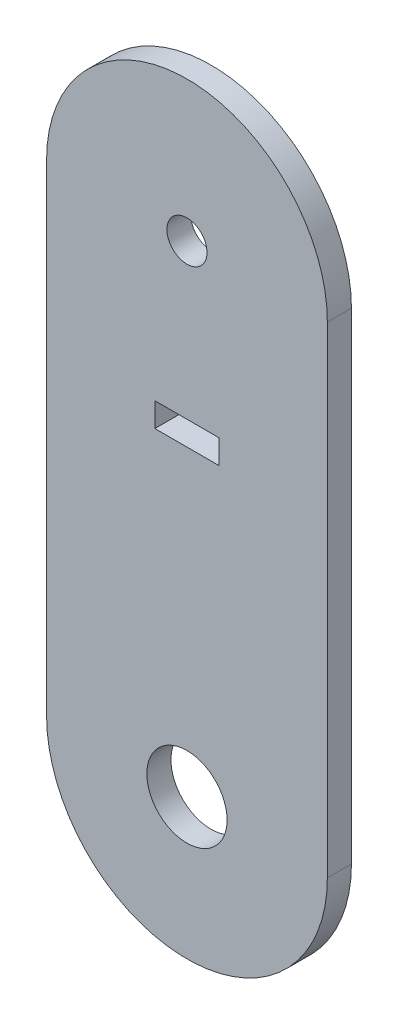
ISO-10303-21;
HEADER;
FILE_DESCRIPTION(('STEP AP214'),'2;1');
FILE_NAME('part.step','',(''),(''),'','','');
FILE_SCHEMA(('AUTOMOTIVE_DESIGN { 1 0 10303 214 1 1 1 1 }'));
ENDSEC;
DATA;
#1=APPLICATION_CONTEXT('core data for automotive mechanical design processes');
#2=APPLICATION_PROTOCOL_DEFINITION('international standard','automotive_design',2000,#1);
#3=PRODUCT_CONTEXT('',#1,'mechanical');
#4=PRODUCT('Part','Part','',(#3));
#5=PRODUCT_RELATED_PRODUCT_CATEGORY('part','',(#4));
#6=PRODUCT_DEFINITION_FORMATION('','',#4);
#7=PRODUCT_DEFINITION_CONTEXT('part definition',#1,'design');
#8=PRODUCT_DEFINITION('design','',#6,#7);
#9=PRODUCT_DEFINITION_SHAPE('','',#8);
#10=(LENGTH_UNIT() NAMED_UNIT(*) SI_UNIT(.MILLI.,.METRE.));
#11=(NAMED_UNIT(*) PLANE_ANGLE_UNIT() SI_UNIT($,.RADIAN.));
#12=(NAMED_UNIT(*) SI_UNIT($,.STERADIAN.) SOLID_ANGLE_UNIT());
#13=UNCERTAINTY_MEASURE_WITH_UNIT(LENGTH_MEASURE(1.E-05),#10,'distance_accuracy_value','');
#14=(GEOMETRIC_REPRESENTATION_CONTEXT(3) GLOBAL_UNCERTAINTY_ASSIGNED_CONTEXT((#13)) GLOBAL_UNIT_ASSIGNED_CONTEXT((#10,
#11,#12)) REPRESENTATION_CONTEXT('',''));
#15=CARTESIAN_POINT('',(0.,0.,0.));
#16=DIRECTION('',(0.,0.,1.));
#17=DIRECTION('',(1.,0.,0.));
#18=AXIS2_PLACEMENT_3D('',#15,#16,#17);
#19=CARTESIAN_POINT('',(0.,-30.,3.));
#20=DIRECTION('',(0.,0.,-1.));
#21=DIRECTION('',(-1.,0.,0.));
#22=AXIS2_PLACEMENT_3D('',#19,#20,#21);
#23=PLANE('',#22);
#24=CARTESIAN_POINT('',(0.,-30.,3.));
#25=DIRECTION('',(0.,0.,-1.));
#26=DIRECTION('',(-1.,0.,0.));
#27=AXIS2_PLACEMENT_3D('',#24,#25,#26);
#28=CIRCLE('',#27,17.5);
#29=CARTESIAN_POINT('',(17.5,-30.,3.));
#30=VERTEX_POINT('',#29);
#31=CARTESIAN_POINT('',(-17.5,-30.,3.));
#32=VERTEX_POINT('',#31);
#33=EDGE_CURVE('E147',#30,#32,#28,.T.);
#34=ORIENTED_EDGE('',*,*,#33,.F.);
#35=DIRECTION('',(0.,1.,0.));
#36=VECTOR('',#35,1.);
#37=CARTESIAN_POINT('',(17.5,-30.,3.));
#38=LINE('',#37,#36);
#39=CARTESIAN_POINT('',(17.5,30.,3.));
#40=VERTEX_POINT('',#39);
#41=EDGE_CURVE('E157',#30,#40,#38,.T.);
#42=ORIENTED_EDGE('',*,*,#41,.T.);
#43=CARTESIAN_POINT('',(0.,30.,3.));
#44=DIRECTION('',(0.,0.,-1.));
#45=DIRECTION('',(-1.,0.,0.));
#46=AXIS2_PLACEMENT_3D('',#43,#44,#45);
#47=CIRCLE('',#46,17.5);
#48=CARTESIAN_POINT('',(-17.5,30.,3.));
#49=VERTEX_POINT('',#48);
#50=EDGE_CURVE('E154',#49,#40,#47,.T.);
#51=ORIENTED_EDGE('',*,*,#50,.F.);
#52=DIRECTION('',(0.,1.,0.));
#53=VECTOR('',#52,1.);
#54=CARTESIAN_POINT('',(-17.5,-30.,3.));
#55=LINE('',#54,#53);
#56=EDGE_CURVE('E150',#32,#49,#55,.T.);
#57=ORIENTED_EDGE('',*,*,#56,.F.);
#58=EDGE_LOOP('',(#34,#42,#51,#57));
#59=FACE_BOUND('',#58,.T.);
#60=CARTESIAN_POINT('',(0.,30.,3.));
#61=DIRECTION('',(0.,0.,1.));
#62=DIRECTION('',(1.,0.,0.));
#63=AXIS2_PLACEMENT_3D('',#60,#61,#62);
#64=CIRCLE('',#63,2.5);
#65=CARTESIAN_POINT('',(2.5,30.,3.));
#66=VERTEX_POINT('',#65);
#67=EDGE_CURVE('E141',#66,#66,#64,.T.);
#68=ORIENTED_EDGE('',*,*,#67,.F.);
#69=EDGE_LOOP('',(#68));
#70=FACE_BOUND('',#69,.T.);
#71=CARTESIAN_POINT('',(0.,-30.,3.));
#72=DIRECTION('',(0.,0.,1.));
#73=DIRECTION('',(1.,0.,0.));
#74=AXIS2_PLACEMENT_3D('',#71,#72,#73);
#75=CIRCLE('',#74,5.);
#76=CARTESIAN_POINT('',(5.,-30.,3.));
#77=VERTEX_POINT('',#76);
#78=EDGE_CURVE('E135',#77,#77,#75,.T.);
#79=ORIENTED_EDGE('',*,*,#78,.F.);
#80=EDGE_LOOP('',(#79));
#81=FACE_BOUND('',#80,.T.);
#82=DIRECTION('',(0.,-1.,0.));
#83=VECTOR('',#82,1.);
#84=CARTESIAN_POINT('',(-4.,-30.,3.));
#85=LINE('',#84,#83);
#86=CARTESIAN_POINT('',(-4.,10.76,3.));
#87=VERTEX_POINT('',#86);
#88=CARTESIAN_POINT('',(-4.,7.76,3.));
#89=VERTEX_POINT('',#88);
#90=EDGE_CURVE('E102',#87,#89,#85,.T.);
#91=ORIENTED_EDGE('',*,*,#90,.F.);
#92=DIRECTION('',(-1.,0.,0.));
#93=VECTOR('',#92,1.);
#94=CARTESIAN_POINT('',(0.,10.76,3.));
#95=LINE('',#94,#93);
#96=CARTESIAN_POINT('',(4.,10.76,3.));
#97=VERTEX_POINT('',#96);
#98=EDGE_CURVE('E105',#97,#87,#95,.T.);
#99=ORIENTED_EDGE('',*,*,#98,.F.);
#100=DIRECTION('',(0.,1.,0.));
#101=VECTOR('',#100,1.);
#102=CARTESIAN_POINT('',(4.,-30.,3.));
#103=LINE('',#102,#101);
#104=CARTESIAN_POINT('',(4.,7.76,3.));
#105=VERTEX_POINT('',#104);
#106=EDGE_CURVE('E129',#105,#97,#103,.T.);
#107=ORIENTED_EDGE('',*,*,#106,.F.);
#108=DIRECTION('',(1.,0.,0.));
#109=VECTOR('',#108,1.);
#110=CARTESIAN_POINT('',(0.,7.76,3.));
#111=LINE('',#110,#109);
#112=EDGE_CURVE('E131',#89,#105,#111,.T.);
#113=ORIENTED_EDGE('',*,*,#112,.F.);
#114=EDGE_LOOP('',(#91,#99,#107,#113));
#115=FACE_BOUND('',#114,.T.);
#116=ADVANCED_FACE('F33',(#59,#70,#81,#115),#23,.F.);
#117=CARTESIAN_POINT('',(0.,-30.,0.));
#118=DIRECTION('',(0.,0.,-1.));
#119=DIRECTION('',(-1.,0.,0.));
#120=AXIS2_PLACEMENT_3D('',#117,#118,#119);
#121=PLANE('',#120);
#122=CARTESIAN_POINT('',(0.,-30.,0.));
#123=DIRECTION('',(0.,0.,-1.));
#124=DIRECTION('',(-1.,0.,0.));
#125=AXIS2_PLACEMENT_3D('',#122,#123,#124);
#126=CIRCLE('',#125,5.);
#127=CARTESIAN_POINT('',(5.,-30.,0.));
#128=VERTEX_POINT('',#127);
#129=EDGE_CURVE('E134',#128,#128,#126,.F.);
#130=ORIENTED_EDGE('',*,*,#129,.T.);
#131=EDGE_LOOP('',(#130));
#132=FACE_BOUND('',#131,.T.);
#133=CARTESIAN_POINT('',(0.,30.,0.));
#134=DIRECTION('',(0.,0.,-1.));
#135=DIRECTION('',(-1.,0.,0.));
#136=AXIS2_PLACEMENT_3D('',#133,#134,#135);
#137=CIRCLE('',#136,2.5);
#138=CARTESIAN_POINT('',(2.5,30.,0.));
#139=VERTEX_POINT('',#138);
#140=EDGE_CURVE('E138',#139,#139,#137,.F.);
#141=ORIENTED_EDGE('',*,*,#140,.T.);
#142=EDGE_LOOP('',(#141));
#143=FACE_BOUND('',#142,.T.);
#144=CARTESIAN_POINT('',(0.,-30.,0.));
#145=DIRECTION('',(0.,0.,-1.));
#146=DIRECTION('',(-1.,0.,0.));
#147=AXIS2_PLACEMENT_3D('',#144,#145,#146);
#148=CIRCLE('',#147,17.5);
#149=CARTESIAN_POINT('',(17.5,-30.,0.));
#150=VERTEX_POINT('',#149);
#151=CARTESIAN_POINT('',(-17.5,-30.,0.));
#152=VERTEX_POINT('',#151);
#153=EDGE_CURVE('E144',#150,#152,#148,.T.);
#154=ORIENTED_EDGE('',*,*,#153,.T.);
#155=DIRECTION('',(0.,1.,0.));
#156=VECTOR('',#155,1.);
#157=CARTESIAN_POINT('',(-17.5,-30.,0.));
#158=LINE('',#157,#156);
#159=CARTESIAN_POINT('',(-17.5,30.,0.));
#160=VERTEX_POINT('',#159);
#161=EDGE_CURVE('E161',#152,#160,#158,.T.);
#162=ORIENTED_EDGE('',*,*,#161,.T.);
#163=CARTESIAN_POINT('',(0.,30.,0.));
#164=DIRECTION('',(0.,0.,-1.));
#165=DIRECTION('',(-1.,0.,0.));
#166=AXIS2_PLACEMENT_3D('',#163,#164,#165);
#167=CIRCLE('',#166,17.5);
#168=CARTESIAN_POINT('',(17.5,30.,0.));
#169=VERTEX_POINT('',#168);
#170=EDGE_CURVE('E164',#160,#169,#167,.T.);
#171=ORIENTED_EDGE('',*,*,#170,.T.);
#172=DIRECTION('',(0.,1.,0.));
#173=VECTOR('',#172,1.);
#174=CARTESIAN_POINT('',(17.5,-30.,0.));
#175=LINE('',#174,#173);
#176=EDGE_CURVE('E151',#150,#169,#175,.T.);
#177=ORIENTED_EDGE('',*,*,#176,.F.);
#178=EDGE_LOOP('',(#154,#162,#171,#177));
#179=FACE_BOUND('',#178,.T.);
#180=DIRECTION('',(-1.,0.,0.));
#181=VECTOR('',#180,1.);
#182=CARTESIAN_POINT('',(-4.,10.76,0.));
#183=LINE('',#182,#181);
#184=CARTESIAN_POINT('',(4.,10.76,0.));
#185=VERTEX_POINT('',#184);
#186=CARTESIAN_POINT('',(-4.,10.76,0.));
#187=VERTEX_POINT('',#186);
#188=EDGE_CURVE('E119',#185,#187,#183,.T.);
#189=ORIENTED_EDGE('',*,*,#188,.T.);
#190=DIRECTION('',(0.,-1.,0.));
#191=VECTOR('',#190,1.);
#192=CARTESIAN_POINT('',(-4.,10.76,0.));
#193=LINE('',#192,#191);
#194=CARTESIAN_POINT('',(-4.,7.76,0.));
#195=VERTEX_POINT('',#194);
#196=EDGE_CURVE('E58',#187,#195,#193,.T.);
#197=ORIENTED_EDGE('',*,*,#196,.T.);
#198=DIRECTION('',(1.,0.,0.));
#199=VECTOR('',#198,1.);
#200=CARTESIAN_POINT('',(-4.,7.76,0.));
#201=LINE('',#200,#199);
#202=CARTESIAN_POINT('',(4.,7.76,0.));
#203=VERTEX_POINT('',#202);
#204=EDGE_CURVE('E109',#195,#203,#201,.T.);
#205=ORIENTED_EDGE('',*,*,#204,.T.);
#206=DIRECTION('',(0.,1.,0.));
#207=VECTOR('',#206,1.);
#208=CARTESIAN_POINT('',(4.,10.76,0.));
#209=LINE('',#208,#207);
#210=EDGE_CURVE('E121',#203,#185,#209,.T.);
#211=ORIENTED_EDGE('',*,*,#210,.T.);
#212=EDGE_LOOP('',(#189,#197,#205,#211));
#213=FACE_BOUND('',#212,.T.);
#214=ADVANCED_FACE('F118',(#132,#143,#179,#213),#121,.T.);
#215=CARTESIAN_POINT('',(0.,-30.,3.));
#216=DIRECTION('',(0.,0.,-1.));
#217=DIRECTION('',(-1.,0.,0.));
#218=AXIS2_PLACEMENT_3D('',#215,#216,#217);
#219=CYLINDRICAL_SURFACE('',#218,17.5);
#220=ORIENTED_EDGE('',*,*,#153,.F.);
#221=DIRECTION('',(0.,0.,-1.));
#222=VECTOR('',#221,1.);
#223=CARTESIAN_POINT('',(17.5,-30.,3.));
#224=LINE('',#223,#222);
#225=EDGE_CURVE('E11',#30,#150,#224,.T.);
#226=ORIENTED_EDGE('',*,*,#225,.F.);
#227=ORIENTED_EDGE('',*,*,#33,.T.);
#228=DIRECTION('',(0.,0.,-1.));
#229=VECTOR('',#228,1.);
#230=CARTESIAN_POINT('',(-17.5,-30.,3.));
#231=LINE('',#230,#229);
#232=EDGE_CURVE('E37',#32,#152,#231,.T.);
#233=ORIENTED_EDGE('',*,*,#232,.T.);
#234=EDGE_LOOP('',(#220,#226,#227,#233));
#235=FACE_BOUND('',#234,.T.);
#236=ADVANCED_FACE('F35',(#235),#219,.T.);
#237=CARTESIAN_POINT('',(17.5,-30.,3.));
#238=DIRECTION('',(-1.,0.,0.));
#239=DIRECTION('',(0.,0.,1.));
#240=AXIS2_PLACEMENT_3D('',#237,#238,#239);
#241=PLANE('',#240);
#242=ORIENTED_EDGE('',*,*,#176,.T.);
#243=DIRECTION('',(0.,0.,-1.));
#244=VECTOR('',#243,1.);
#245=CARTESIAN_POINT('',(17.5,30.,3.));
#246=LINE('',#245,#244);
#247=EDGE_CURVE('E42',#40,#169,#246,.T.);
#248=ORIENTED_EDGE('',*,*,#247,.F.);
#249=ORIENTED_EDGE('',*,*,#41,.F.);
#250=ORIENTED_EDGE('',*,*,#225,.T.);
#251=EDGE_LOOP('',(#242,#248,#249,#250));
#252=FACE_BOUND('',#251,.T.);
#253=ADVANCED_FACE('F182',(#252),#241,.F.);
#254=CARTESIAN_POINT('',(0.,30.,3.));
#255=DIRECTION('',(0.,0.,-1.));
#256=DIRECTION('',(-1.,0.,0.));
#257=AXIS2_PLACEMENT_3D('',#254,#255,#256);
#258=CYLINDRICAL_SURFACE('',#257,17.5);
#259=ORIENTED_EDGE('',*,*,#170,.F.);
#260=DIRECTION('',(0.,0.,-1.));
#261=VECTOR('',#260,1.);
#262=CARTESIAN_POINT('',(-17.5,30.,3.));
#263=LINE('',#262,#261);
#264=EDGE_CURVE('E169',#49,#160,#263,.T.);
#265=ORIENTED_EDGE('',*,*,#264,.F.);
#266=ORIENTED_EDGE('',*,*,#50,.T.);
#267=ORIENTED_EDGE('',*,*,#247,.T.);
#268=EDGE_LOOP('',(#259,#265,#266,#267));
#269=FACE_BOUND('',#268,.T.);
#270=ADVANCED_FACE('F188',(#269),#258,.T.);
#271=CARTESIAN_POINT('',(-17.5,-30.,3.));
#272=DIRECTION('',(-1.,0.,0.));
#273=DIRECTION('',(0.,0.,1.));
#274=AXIS2_PLACEMENT_3D('',#271,#272,#273);
#275=PLANE('',#274);
#276=ORIENTED_EDGE('',*,*,#161,.F.);
#277=ORIENTED_EDGE('',*,*,#232,.F.);
#278=ORIENTED_EDGE('',*,*,#56,.T.);
#279=ORIENTED_EDGE('',*,*,#264,.T.);
#280=EDGE_LOOP('',(#276,#277,#278,#279));
#281=FACE_BOUND('',#280,.T.);
#282=ADVANCED_FACE('F177',(#281),#275,.T.);
#283=CARTESIAN_POINT('',(0.,30.,-0.00100000000000013));
#284=DIRECTION('',(0.,0.,1.));
#285=DIRECTION('',(1.,0.,0.));
#286=AXIS2_PLACEMENT_3D('',#283,#284,#285);
#287=CYLINDRICAL_SURFACE('',#286,2.5);
#288=CARTESIAN_POINT('',(2.5,30.,0.));
#289=CARTESIAN_POINT('',(2.5,30.,0.03125));
#290=CARTESIAN_POINT('',(2.5,30.,0.0625));
#291=CARTESIAN_POINT('',(2.5,30.,0.125));
#292=CARTESIAN_POINT('',(2.5,30.,0.15625));
#293=CARTESIAN_POINT('',(2.5,30.,0.21875));
#294=CARTESIAN_POINT('',(2.5,30.,0.25));
#295=CARTESIAN_POINT('',(2.5,30.,0.3125));
#296=CARTESIAN_POINT('',(2.5,30.,0.34375));
#297=CARTESIAN_POINT('',(2.5,30.,0.40625));
#298=CARTESIAN_POINT('',(2.5,30.,0.4375));
#299=CARTESIAN_POINT('',(2.5,30.,0.5));
#300=CARTESIAN_POINT('',(2.5,30.,0.53125));
#301=CARTESIAN_POINT('',(2.5,30.,0.59375));
#302=CARTESIAN_POINT('',(2.5,30.,0.625));
#303=CARTESIAN_POINT('',(2.5,30.,0.6875));
#304=CARTESIAN_POINT('',(2.5,30.,0.71875));
#305=CARTESIAN_POINT('',(2.5,30.,0.78125));
#306=CARTESIAN_POINT('',(2.5,30.,0.8125));
#307=CARTESIAN_POINT('',(2.5,30.,0.875));
#308=CARTESIAN_POINT('',(2.5,30.,0.90625));
#309=CARTESIAN_POINT('',(2.5,30.,0.96875));
#310=CARTESIAN_POINT('',(2.5,30.,1.));
#311=CARTESIAN_POINT('',(2.5,30.,1.0625));
#312=CARTESIAN_POINT('',(2.5,30.,1.09375));
#313=CARTESIAN_POINT('',(2.5,30.,1.15625));
#314=CARTESIAN_POINT('',(2.5,30.,1.1875));
#315=CARTESIAN_POINT('',(2.5,30.,1.25));
#316=CARTESIAN_POINT('',(2.5,30.,1.28125));
#317=CARTESIAN_POINT('',(2.5,30.,1.34375));
#318=CARTESIAN_POINT('',(2.5,30.,1.375));
#319=CARTESIAN_POINT('',(2.5,30.,1.4375));
#320=CARTESIAN_POINT('',(2.5,30.,1.46875));
#321=CARTESIAN_POINT('',(2.5,30.,1.53125));
#322=CARTESIAN_POINT('',(2.5,30.,1.5625));
#323=CARTESIAN_POINT('',(2.5,30.,1.625));
#324=CARTESIAN_POINT('',(2.5,30.,1.65625));
#325=CARTESIAN_POINT('',(2.5,30.,1.71875));
#326=CARTESIAN_POINT('',(2.5,30.,1.75));
#327=CARTESIAN_POINT('',(2.5,30.,1.8125));
#328=CARTESIAN_POINT('',(2.5,30.,1.84375));
#329=CARTESIAN_POINT('',(2.5,30.,1.90625));
#330=CARTESIAN_POINT('',(2.5,30.,1.9375));
#331=CARTESIAN_POINT('',(2.5,30.,2.));
#332=CARTESIAN_POINT('',(2.5,30.,2.03125));
#333=CARTESIAN_POINT('',(2.5,30.,2.09375));
#334=CARTESIAN_POINT('',(2.5,30.,2.125));
#335=CARTESIAN_POINT('',(2.5,30.,2.1875));
#336=CARTESIAN_POINT('',(2.5,30.,2.21875));
#337=CARTESIAN_POINT('',(2.5,30.,2.28125));
#338=CARTESIAN_POINT('',(2.5,30.,2.3125));
#339=CARTESIAN_POINT('',(2.5,30.,2.375));
#340=CARTESIAN_POINT('',(2.5,30.,2.40625));
#341=CARTESIAN_POINT('',(2.5,30.,2.46875));
#342=CARTESIAN_POINT('',(2.5,30.,2.5));
#343=CARTESIAN_POINT('',(2.5,30.,2.5625));
#344=CARTESIAN_POINT('',(2.5,30.,2.59375));
#345=CARTESIAN_POINT('',(2.5,30.,2.65625));
#346=CARTESIAN_POINT('',(2.5,30.,2.6875));
#347=CARTESIAN_POINT('',(2.5,30.,2.75));
#348=CARTESIAN_POINT('',(2.5,30.,2.78125));
#349=CARTESIAN_POINT('',(2.5,30.,2.84375));
#350=CARTESIAN_POINT('',(2.5,30.,2.875));
#351=CARTESIAN_POINT('',(2.5,30.,2.9375));
#352=CARTESIAN_POINT('',(2.5,30.,2.96875));
#353=CARTESIAN_POINT('',(2.5,30.,3.));
#354=B_SPLINE_CURVE_WITH_KNOTS('',3,(#288,#289,#290,#291,#292,#293,#294,#295,#296,#297,#298,
#299,#300,#301,#302,#303,#304,#305,#306,#307,#308,#309,#310,#311,#312,#313,#314,#315,#316,#317,
#318,#319,#320,#321,#322,#323,#324,#325,#326,#327,#328,#329,#330,#331,#332,#333,#334,#335,#336,
#337,#338,#339,#340,#341,#342,#343,#344,#345,#346,#347,#348,#349,#350,#351,#352,#353),
.UNSPECIFIED.,.F.,.F.,(4,2,2,2,2,2,2,2,2,2,2,2,2,2,2,2,2,2,2,2,2,2,2,2,2,2,2,2,2,2,2,2,4),(0.,
0.09375,0.1875,0.28125,0.375,0.46875,0.5625,0.65625,0.75,0.84375,0.9375,1.03125,1.125,1.21875,
1.3125,1.40625,1.5,1.59375,1.6875,1.78125,1.875,1.96875,2.0625,2.15625,2.25,2.34375,2.4375,
2.53125,2.625,2.71875,2.8125,2.90625,3.),.UNSPECIFIED.);
#355=EDGE_CURVE('BSEAM195',#139,#66,#354,.T.);
#356=ORIENTED_EDGE('',*,*,#140,.F.);
#357=ORIENTED_EDGE('',*,*,#67,.T.);
#358=ORIENTED_EDGE('',*,*,#355,.T.);
#359=ORIENTED_EDGE('',*,*,#355,.F.);
#360=EDGE_LOOP('',(#356,#358,#357,#359));
#361=FACE_BOUND('',#360,.T.);
#362=ADVANCED_FACE('F195',(#361),#287,.F.);
#363=CARTESIAN_POINT('',(0.,-30.,-0.00100000000000013));
#364=DIRECTION('',(0.,0.,1.));
#365=DIRECTION('',(1.,0.,0.));
#366=AXIS2_PLACEMENT_3D('',#363,#364,#365);
#367=CYLINDRICAL_SURFACE('',#366,5.);
#368=CARTESIAN_POINT('',(5.,-30.,0.));
#369=CARTESIAN_POINT('',(5.,-30.,0.03125));
#370=CARTESIAN_POINT('',(5.,-30.,0.0625));
#371=CARTESIAN_POINT('',(5.,-30.,0.125));
#372=CARTESIAN_POINT('',(5.,-30.,0.15625));
#373=CARTESIAN_POINT('',(5.,-30.,0.21875));
#374=CARTESIAN_POINT('',(5.,-30.,0.25));
#375=CARTESIAN_POINT('',(5.,-30.,0.3125));
#376=CARTESIAN_POINT('',(5.,-30.,0.34375));
#377=CARTESIAN_POINT('',(5.,-30.,0.40625));
#378=CARTESIAN_POINT('',(5.,-30.,0.4375));
#379=CARTESIAN_POINT('',(5.,-30.,0.5));
#380=CARTESIAN_POINT('',(5.,-30.,0.53125));
#381=CARTESIAN_POINT('',(5.,-30.,0.59375));
#382=CARTESIAN_POINT('',(5.,-30.,0.625));
#383=CARTESIAN_POINT('',(5.,-30.,0.6875));
#384=CARTESIAN_POINT('',(5.,-30.,0.71875));
#385=CARTESIAN_POINT('',(5.,-30.,0.78125));
#386=CARTESIAN_POINT('',(5.,-30.,0.8125));
#387=CARTESIAN_POINT('',(5.,-30.,0.875));
#388=CARTESIAN_POINT('',(5.,-30.,0.90625));
#389=CARTESIAN_POINT('',(5.,-30.,0.96875));
#390=CARTESIAN_POINT('',(5.,-30.,1.));
#391=CARTESIAN_POINT('',(5.,-30.,1.0625));
#392=CARTESIAN_POINT('',(5.,-30.,1.09375));
#393=CARTESIAN_POINT('',(5.,-30.,1.15625));
#394=CARTESIAN_POINT('',(5.,-30.,1.1875));
#395=CARTESIAN_POINT('',(5.,-30.,1.25));
#396=CARTESIAN_POINT('',(5.,-30.,1.28125));
#397=CARTESIAN_POINT('',(5.,-30.,1.34375));
#398=CARTESIAN_POINT('',(5.,-30.,1.375));
#399=CARTESIAN_POINT('',(5.,-30.,1.4375));
#400=CARTESIAN_POINT('',(5.,-30.,1.46875));
#401=CARTESIAN_POINT('',(5.,-30.,1.53125));
#402=CARTESIAN_POINT('',(5.,-30.,1.5625));
#403=CARTESIAN_POINT('',(5.,-30.,1.625));
#404=CARTESIAN_POINT('',(5.,-30.,1.65625));
#405=CARTESIAN_POINT('',(5.,-30.,1.71875));
#406=CARTESIAN_POINT('',(5.,-30.,1.75));
#407=CARTESIAN_POINT('',(5.,-30.,1.8125));
#408=CARTESIAN_POINT('',(5.,-30.,1.84375));
#409=CARTESIAN_POINT('',(5.,-30.,1.90625));
#410=CARTESIAN_POINT('',(5.,-30.,1.9375));
#411=CARTESIAN_POINT('',(5.,-30.,2.));
#412=CARTESIAN_POINT('',(5.,-30.,2.03125));
#413=CARTESIAN_POINT('',(5.,-30.,2.09375));
#414=CARTESIAN_POINT('',(5.,-30.,2.125));
#415=CARTESIAN_POINT('',(5.,-30.,2.1875));
#416=CARTESIAN_POINT('',(5.,-30.,2.21875));
#417=CARTESIAN_POINT('',(5.,-30.,2.28125));
#418=CARTESIAN_POINT('',(5.,-30.,2.3125));
#419=CARTESIAN_POINT('',(5.,-30.,2.375));
#420=CARTESIAN_POINT('',(5.,-30.,2.40625));
#421=CARTESIAN_POINT('',(5.,-30.,2.46875));
#422=CARTESIAN_POINT('',(5.,-30.,2.5));
#423=CARTESIAN_POINT('',(5.,-30.,2.5625));
#424=CARTESIAN_POINT('',(5.,-30.,2.59375));
#425=CARTESIAN_POINT('',(5.,-30.,2.65625));
#426=CARTESIAN_POINT('',(5.,-30.,2.6875));
#427=CARTESIAN_POINT('',(5.,-30.,2.75));
#428=CARTESIAN_POINT('',(5.,-30.,2.78125));
#429=CARTESIAN_POINT('',(5.,-30.,2.84375));
#430=CARTESIAN_POINT('',(5.,-30.,2.875));
#431=CARTESIAN_POINT('',(5.,-30.,2.9375));
#432=CARTESIAN_POINT('',(5.,-30.,2.96875));
#433=CARTESIAN_POINT('',(5.,-30.,3.));
#434=B_SPLINE_CURVE_WITH_KNOTS('',3,(#368,#369,#370,#371,#372,#373,#374,#375,#376,#377,#378,
#379,#380,#381,#382,#383,#384,#385,#386,#387,#388,#389,#390,#391,#392,#393,#394,#395,#396,#397,
#398,#399,#400,#401,#402,#403,#404,#405,#406,#407,#408,#409,#410,#411,#412,#413,#414,#415,#416,
#417,#418,#419,#420,#421,#422,#423,#424,#425,#426,#427,#428,#429,#430,#431,#432,#433),
.UNSPECIFIED.,.F.,.F.,(4,2,2,2,2,2,2,2,2,2,2,2,2,2,2,2,2,2,2,2,2,2,2,2,2,2,2,2,2,2,2,2,4),(0.,
0.09375,0.1875,0.28125,0.375,0.46875,0.5625,0.65625,0.75,0.84375,0.9375,1.03125,1.125,1.21875,
1.3125,1.40625,1.5,1.59375,1.6875,1.78125,1.875,1.96875,2.0625,2.15625,2.25,2.34375,2.4375,
2.53125,2.625,2.71875,2.8125,2.90625,3.),.UNSPECIFIED.);
#435=EDGE_CURVE('BSEAM207',#128,#77,#434,.T.);
#436=ORIENTED_EDGE('',*,*,#129,.F.);
#437=ORIENTED_EDGE('',*,*,#78,.T.);
#438=ORIENTED_EDGE('',*,*,#435,.T.);
#439=ORIENTED_EDGE('',*,*,#435,.F.);
#440=EDGE_LOOP('',(#436,#438,#437,#439));
#441=FACE_BOUND('',#440,.T.);
#442=ADVANCED_FACE('F207',(#441),#367,.F.);
#443=CARTESIAN_POINT('',(-4.,10.76,3.000012));
#444=DIRECTION('',(1.,0.,0.));
#445=DIRECTION('',(0.,0.,-1.));
#446=AXIS2_PLACEMENT_3D('',#443,#444,#445);
#447=PLANE('',#446);
#448=ORIENTED_EDGE('',*,*,#90,.T.);
#449=DIRECTION('',(0.,0.,-1.));
#450=VECTOR('',#449,1.);
#451=CARTESIAN_POINT('',(-4.,7.76,3.000012));
#452=LINE('',#451,#450);
#453=EDGE_CURVE('E98',#89,#195,#452,.T.);
#454=ORIENTED_EDGE('',*,*,#453,.T.);
#455=ORIENTED_EDGE('',*,*,#196,.F.);
#456=DIRECTION('',(0.,0.,-1.));
#457=VECTOR('',#456,1.);
#458=CARTESIAN_POINT('',(-4.,10.76,3.000012));
#459=LINE('',#458,#457);
#460=EDGE_CURVE('E115',#87,#187,#459,.T.);
#461=ORIENTED_EDGE('',*,*,#460,.F.);
#462=EDGE_LOOP('',(#448,#454,#455,#461));
#463=FACE_BOUND('',#462,.T.);
#464=ADVANCED_FACE('F100',(#463),#447,.T.);
#465=CARTESIAN_POINT('',(-4.,7.76,3.000012));
#466=DIRECTION('',(0.,1.,0.));
#467=DIRECTION('',(0.,0.,1.));
#468=AXIS2_PLACEMENT_3D('',#465,#466,#467);
#469=PLANE('',#468);
#470=ORIENTED_EDGE('',*,*,#112,.T.);
#471=DIRECTION('',(0.,0.,-1.));
#472=VECTOR('',#471,1.);
#473=CARTESIAN_POINT('',(4.,7.76,3.000012));
#474=LINE('',#473,#472);
#475=EDGE_CURVE('E106',#105,#203,#474,.T.);
#476=ORIENTED_EDGE('',*,*,#475,.T.);
#477=ORIENTED_EDGE('',*,*,#204,.F.);
#478=ORIENTED_EDGE('',*,*,#453,.F.);
#479=EDGE_LOOP('',(#470,#476,#477,#478));
#480=FACE_BOUND('',#479,.T.);
#481=ADVANCED_FACE('F110',(#480),#469,.T.);
#482=CARTESIAN_POINT('',(4.,10.76,3.000012));
#483=DIRECTION('',(-1.,0.,0.));
#484=DIRECTION('',(0.,0.,1.));
#485=AXIS2_PLACEMENT_3D('',#482,#483,#484);
#486=PLANE('',#485);
#487=ORIENTED_EDGE('',*,*,#106,.T.);
#488=DIRECTION('',(0.,0.,-1.));
#489=VECTOR('',#488,1.);
#490=CARTESIAN_POINT('',(4.,10.76,3.000012));
#491=LINE('',#490,#489);
#492=EDGE_CURVE('E50',#97,#185,#491,.T.);
#493=ORIENTED_EDGE('',*,*,#492,.T.);
#494=ORIENTED_EDGE('',*,*,#210,.F.);
#495=ORIENTED_EDGE('',*,*,#475,.F.);
#496=EDGE_LOOP('',(#487,#493,#494,#495));
#497=FACE_BOUND('',#496,.T.);
#498=ADVANCED_FACE('F216',(#497),#486,.T.);
#499=CARTESIAN_POINT('',(-4.,10.76,3.000012));
#500=DIRECTION('',(0.,-1.,0.));
#501=DIRECTION('',(0.,0.,-1.));
#502=AXIS2_PLACEMENT_3D('',#499,#500,#501);
#503=PLANE('',#502);
#504=ORIENTED_EDGE('',*,*,#98,.T.);
#505=ORIENTED_EDGE('',*,*,#460,.T.);
#506=ORIENTED_EDGE('',*,*,#188,.F.);
#507=ORIENTED_EDGE('',*,*,#492,.F.);
#508=EDGE_LOOP('',(#504,#505,#506,#507));
#509=FACE_BOUND('',#508,.T.);
#510=ADVANCED_FACE('F219',(#509),#503,.T.);
#511=CLOSED_SHELL('',(#116,#214,#236,#253,#270,#282,#362,#442,#464,#481,#498,#510));
#512=MANIFOLD_SOLID_BREP('B2',#511);
#513=ADVANCED_BREP_SHAPE_REPRESENTATION('',(#18,#512),#14);
#514=SHAPE_DEFINITION_REPRESENTATION(#9,#513);
ENDSEC;
END-ISO-10303-21;
